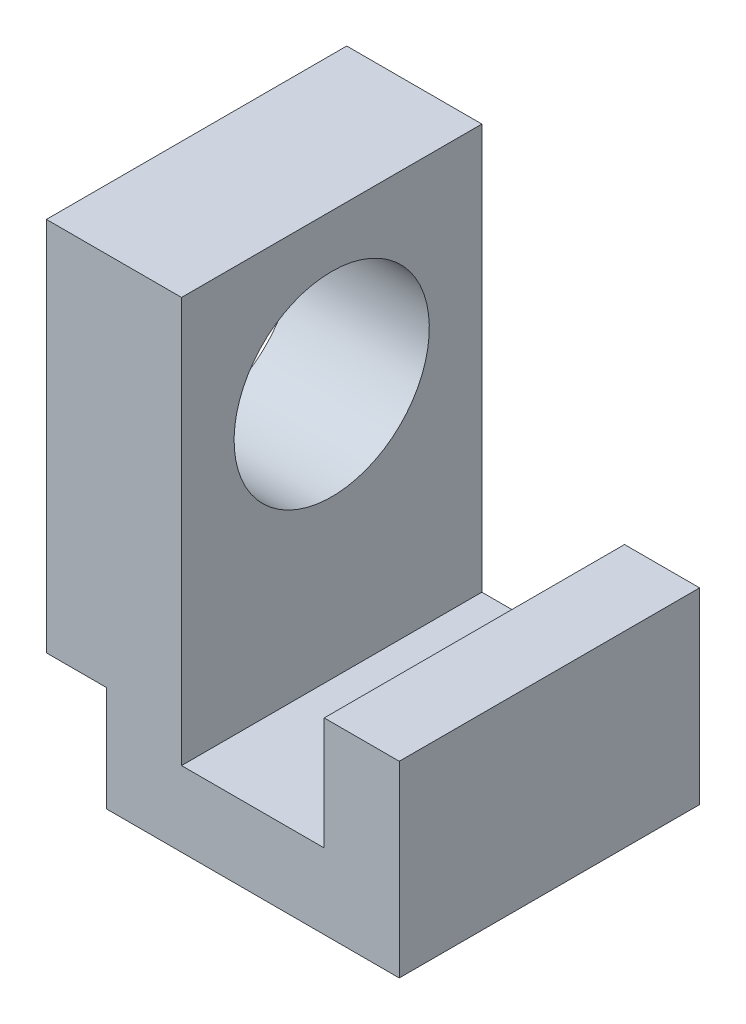
ISO-10303-21;
HEADER;
FILE_DESCRIPTION(('STEP AP214'),'2;1');
FILE_NAME('part.step','',(''),(''),'','','');
FILE_SCHEMA(('AUTOMOTIVE_DESIGN { 1 0 10303 214 1 1 1 1 }'));
ENDSEC;
DATA;
#1=APPLICATION_CONTEXT('core data for automotive mechanical design processes');
#2=APPLICATION_PROTOCOL_DEFINITION('international standard','automotive_design',2000,#1);
#3=PRODUCT_CONTEXT('',#1,'mechanical');
#4=PRODUCT('Part','Part','',(#3));
#5=PRODUCT_RELATED_PRODUCT_CATEGORY('part','',(#4));
#6=PRODUCT_DEFINITION_FORMATION('','',#4);
#7=PRODUCT_DEFINITION_CONTEXT('part definition',#1,'design');
#8=PRODUCT_DEFINITION('design','',#6,#7);
#9=PRODUCT_DEFINITION_SHAPE('','',#8);
#10=(LENGTH_UNIT() NAMED_UNIT(*) SI_UNIT(.MILLI.,.METRE.));
#11=(NAMED_UNIT(*) PLANE_ANGLE_UNIT() SI_UNIT($,.RADIAN.));
#12=(NAMED_UNIT(*) SI_UNIT($,.STERADIAN.) SOLID_ANGLE_UNIT());
#13=UNCERTAINTY_MEASURE_WITH_UNIT(LENGTH_MEASURE(1.E-05),#10,'distance_accuracy_value','');
#14=(GEOMETRIC_REPRESENTATION_CONTEXT(3) GLOBAL_UNCERTAINTY_ASSIGNED_CONTEXT((#13)) GLOBAL_UNIT_ASSIGNED_CONTEXT((#10,
#11,#12)) REPRESENTATION_CONTEXT('',''));
#15=CARTESIAN_POINT('',(0.,0.,0.));
#16=DIRECTION('',(0.,0.,1.));
#17=DIRECTION('',(1.,0.,0.));
#18=AXIS2_PLACEMENT_3D('',#15,#16,#17);
#19=CARTESIAN_POINT('',(39.,0.,20.));
#20=DIRECTION('',(0.,1.,0.));
#21=DIRECTION('',(-1.,0.,0.));
#22=AXIS2_PLACEMENT_3D('',#19,#20,#21);
#23=PLANE('',#22);
#24=DIRECTION('',(1.,0.,0.));
#25=VECTOR('',#24,1.);
#26=CARTESIAN_POINT('',(39.,0.,-20.));
#27=LINE('',#26,#25);
#28=CARTESIAN_POINT('',(0.,0.,-20.));
#29=VERTEX_POINT('',#28);
#30=CARTESIAN_POINT('',(39.,0.,-20.));
#31=VERTEX_POINT('',#30);
#32=EDGE_CURVE('E153',#29,#31,#27,.T.);
#33=ORIENTED_EDGE('',*,*,#32,.T.);
#34=DIRECTION('',(0.,0.,-1.));
#35=VECTOR('',#34,1.);
#36=CARTESIAN_POINT('',(39.,0.,20.));
#37=LINE('',#36,#35);
#38=CARTESIAN_POINT('',(39.,0.,20.));
#39=VERTEX_POINT('',#38);
#40=EDGE_CURVE('E11',#39,#31,#37,.T.);
#41=ORIENTED_EDGE('',*,*,#40,.F.);
#42=DIRECTION('',(1.,0.,0.));
#43=VECTOR('',#42,1.);
#44=CARTESIAN_POINT('',(39.,0.,20.));
#45=LINE('',#44,#43);
#46=CARTESIAN_POINT('',(0.,0.,20.));
#47=VERTEX_POINT('',#46);
#48=EDGE_CURVE('E181',#47,#39,#45,.T.);
#49=ORIENTED_EDGE('',*,*,#48,.F.);
#50=DIRECTION('',(0.,0.,-1.));
#51=VECTOR('',#50,1.);
#52=CARTESIAN_POINT('',(0.,0.,20.));
#53=LINE('',#52,#51);
#54=EDGE_CURVE('E149',#47,#29,#53,.T.);
#55=ORIENTED_EDGE('',*,*,#54,.T.);
#56=EDGE_LOOP('',(#33,#41,#49,#55));
#57=FACE_BOUND('',#56,.T.);
#58=ADVANCED_FACE('F39',(#57),#23,.F.);
#59=CARTESIAN_POINT('',(39.,25.,20.));
#60=DIRECTION('',(-1.,0.,0.));
#61=DIRECTION('',(0.,0.,1.));
#62=AXIS2_PLACEMENT_3D('',#59,#60,#61);
#63=PLANE('',#62);
#64=DIRECTION('',(0.,1.,0.));
#65=VECTOR('',#64,1.);
#66=CARTESIAN_POINT('',(39.,25.,-20.));
#67=LINE('',#66,#65);
#68=CARTESIAN_POINT('',(39.,25.,-20.));
#69=VERTEX_POINT('',#68);
#70=EDGE_CURVE('E157',#31,#69,#67,.T.);
#71=ORIENTED_EDGE('',*,*,#70,.T.);
#72=DIRECTION('',(0.,0.,-1.));
#73=VECTOR('',#72,1.);
#74=CARTESIAN_POINT('',(39.,25.,20.));
#75=LINE('',#74,#73);
#76=CARTESIAN_POINT('',(39.,25.,20.));
#77=VERTEX_POINT('',#76);
#78=EDGE_CURVE('E49',#77,#69,#75,.T.);
#79=ORIENTED_EDGE('',*,*,#78,.F.);
#80=DIRECTION('',(0.,1.,0.));
#81=VECTOR('',#80,1.);
#82=CARTESIAN_POINT('',(39.,25.,20.));
#83=LINE('',#82,#81);
#84=EDGE_CURVE('E106',#39,#77,#83,.T.);
#85=ORIENTED_EDGE('',*,*,#84,.F.);
#86=ORIENTED_EDGE('',*,*,#40,.T.);
#87=EDGE_LOOP('',(#71,#79,#85,#86));
#88=FACE_BOUND('',#87,.T.);
#89=ADVANCED_FACE('F263',(#88),#63,.F.);
#90=CARTESIAN_POINT('',(29.,25.,20.));
#91=DIRECTION('',(0.,-1.,0.));
#92=DIRECTION('',(0.,0.,-1.));
#93=AXIS2_PLACEMENT_3D('',#90,#91,#92);
#94=PLANE('',#93);
#95=DIRECTION('',(-1.,0.,0.));
#96=VECTOR('',#95,1.);
#97=CARTESIAN_POINT('',(29.,25.,-20.));
#98=LINE('',#97,#96);
#99=CARTESIAN_POINT('',(29.,25.,-20.));
#100=VERTEX_POINT('',#99);
#101=EDGE_CURVE('E160',#69,#100,#98,.T.);
#102=ORIENTED_EDGE('',*,*,#101,.T.);
#103=DIRECTION('',(0.,0.,-1.));
#104=VECTOR('',#103,1.);
#105=CARTESIAN_POINT('',(29.,25.,20.));
#106=LINE('',#105,#104);
#107=CARTESIAN_POINT('',(29.,25.,20.));
#108=VERTEX_POINT('',#107);
#109=EDGE_CURVE('E200',#108,#100,#106,.T.);
#110=ORIENTED_EDGE('',*,*,#109,.F.);
#111=DIRECTION('',(-1.,0.,0.));
#112=VECTOR('',#111,1.);
#113=CARTESIAN_POINT('',(29.,25.,20.));
#114=LINE('',#113,#112);
#115=EDGE_CURVE('E211',#77,#108,#114,.T.);
#116=ORIENTED_EDGE('',*,*,#115,.F.);
#117=ORIENTED_EDGE('',*,*,#78,.T.);
#118=EDGE_LOOP('',(#102,#110,#116,#117));
#119=FACE_BOUND('',#118,.T.);
#120=ADVANCED_FACE('F209',(#119),#94,.F.);
#121=CARTESIAN_POINT('',(29.,10.,20.));
#122=DIRECTION('',(1.,0.,0.));
#123=DIRECTION('',(0.,0.,-1.));
#124=AXIS2_PLACEMENT_3D('',#121,#122,#123);
#125=PLANE('',#124);
#126=DIRECTION('',(0.,-1.,0.));
#127=VECTOR('',#126,1.);
#128=CARTESIAN_POINT('',(29.,10.,-20.));
#129=LINE('',#128,#127);
#130=CARTESIAN_POINT('',(29.,10.,-20.));
#131=VERTEX_POINT('',#130);
#132=EDGE_CURVE('E163',#100,#131,#129,.T.);
#133=ORIENTED_EDGE('',*,*,#132,.T.);
#134=DIRECTION('',(0.,0.,-1.));
#135=VECTOR('',#134,1.);
#136=CARTESIAN_POINT('',(29.,10.,20.));
#137=LINE('',#136,#135);
#138=CARTESIAN_POINT('',(29.,10.,20.));
#139=VERTEX_POINT('',#138);
#140=EDGE_CURVE('E196',#139,#131,#137,.T.);
#141=ORIENTED_EDGE('',*,*,#140,.F.);
#142=DIRECTION('',(0.,-1.,0.));
#143=VECTOR('',#142,1.);
#144=CARTESIAN_POINT('',(29.,10.,20.));
#145=LINE('',#144,#143);
#146=EDGE_CURVE('E230',#108,#139,#145,.T.);
#147=ORIENTED_EDGE('',*,*,#146,.F.);
#148=ORIENTED_EDGE('',*,*,#109,.T.);
#149=EDGE_LOOP('',(#133,#141,#147,#148));
#150=FACE_BOUND('',#149,.T.);
#151=ADVANCED_FACE('F220',(#150),#125,.F.);
#152=CARTESIAN_POINT('',(10.,9.99999999999999,20.));
#153=DIRECTION('',(0.,-1.,0.));
#154=DIRECTION('',(1.,0.,0.));
#155=AXIS2_PLACEMENT_3D('',#152,#153,#154);
#156=PLANE('',#155);
#157=DIRECTION('',(-1.,0.,0.));
#158=VECTOR('',#157,1.);
#159=CARTESIAN_POINT('',(10.,9.99999999999999,-20.));
#160=LINE('',#159,#158);
#161=CARTESIAN_POINT('',(10.,9.99999999999999,-20.));
#162=VERTEX_POINT('',#161);
#163=EDGE_CURVE('E166',#131,#162,#160,.T.);
#164=ORIENTED_EDGE('',*,*,#163,.T.);
#165=DIRECTION('',(0.,0.,-1.));
#166=VECTOR('',#165,1.);
#167=CARTESIAN_POINT('',(10.,9.99999999999999,20.));
#168=LINE('',#167,#166);
#169=CARTESIAN_POINT('',(10.,9.99999999999999,20.));
#170=VERTEX_POINT('',#169);
#171=EDGE_CURVE('E192',#170,#162,#168,.T.);
#172=ORIENTED_EDGE('',*,*,#171,.F.);
#173=DIRECTION('',(-1.,0.,0.));
#174=VECTOR('',#173,1.);
#175=CARTESIAN_POINT('',(10.,9.99999999999999,20.));
#176=LINE('',#175,#174);
#177=EDGE_CURVE('E226',#139,#170,#176,.T.);
#178=ORIENTED_EDGE('',*,*,#177,.F.);
#179=ORIENTED_EDGE('',*,*,#140,.T.);
#180=EDGE_LOOP('',(#164,#172,#178,#179));
#181=FACE_BOUND('',#180,.T.);
#182=ADVANCED_FACE('F224',(#181),#156,.F.);
#183=CARTESIAN_POINT('',(10.,64.,20.));
#184=DIRECTION('',(-1.,0.,0.));
#185=DIRECTION('',(0.,-1.,0.));
#186=AXIS2_PLACEMENT_3D('',#183,#184,#185);
#187=PLANE('',#186);
#188=CARTESIAN_POINT('',(10.,44.,0.));
#189=DIRECTION('',(1.,0.,0.));
#190=DIRECTION('',(0.,1.,0.));
#191=AXIS2_PLACEMENT_3D('',#188,#189,#190);
#192=CIRCLE('',#191,13.);
#193=CARTESIAN_POINT('',(10.,57.,0.));
#194=VERTEX_POINT('',#193);
#195=EDGE_CURVE('E244',#194,#194,#192,.T.);
#196=ORIENTED_EDGE('',*,*,#195,.F.);
#197=EDGE_LOOP('',(#196));
#198=FACE_BOUND('',#197,.T.);
#199=DIRECTION('',(0.,1.,0.));
#200=VECTOR('',#199,1.);
#201=CARTESIAN_POINT('',(10.,64.,-20.));
#202=LINE('',#201,#200);
#203=CARTESIAN_POINT('',(10.,64.,-20.));
#204=VERTEX_POINT('',#203);
#205=EDGE_CURVE('E169',#162,#204,#202,.T.);
#206=ORIENTED_EDGE('',*,*,#205,.T.);
#207=DIRECTION('',(0.,0.,-1.));
#208=VECTOR('',#207,1.);
#209=CARTESIAN_POINT('',(10.,64.,20.));
#210=LINE('',#209,#208);
#211=CARTESIAN_POINT('',(10.,64.,20.));
#212=VERTEX_POINT('',#211);
#213=EDGE_CURVE('E188',#212,#204,#210,.T.);
#214=ORIENTED_EDGE('',*,*,#213,.F.);
#215=DIRECTION('',(0.,1.,0.));
#216=VECTOR('',#215,1.);
#217=CARTESIAN_POINT('',(10.,64.,20.));
#218=LINE('',#217,#216);
#219=EDGE_CURVE('E229',#170,#212,#218,.T.);
#220=ORIENTED_EDGE('',*,*,#219,.F.);
#221=ORIENTED_EDGE('',*,*,#171,.T.);
#222=EDGE_LOOP('',(#206,#214,#220,#221));
#223=FACE_BOUND('',#222,.T.);
#224=ADVANCED_FACE('F275',(#198,#223),#187,.F.);
#225=CARTESIAN_POINT('',(-8.,64.,20.));
#226=DIRECTION('',(0.,-1.,0.));
#227=DIRECTION('',(0.,0.,-1.));
#228=AXIS2_PLACEMENT_3D('',#225,#226,#227);
#229=PLANE('',#228);
#230=DIRECTION('',(-1.,0.,0.));
#231=VECTOR('',#230,1.);
#232=CARTESIAN_POINT('',(-8.,64.,-20.));
#233=LINE('',#232,#231);
#234=CARTESIAN_POINT('',(-8.,64.,-20.));
#235=VERTEX_POINT('',#234);
#236=EDGE_CURVE('E172',#204,#235,#233,.T.);
#237=ORIENTED_EDGE('',*,*,#236,.T.);
#238=DIRECTION('',(0.,0.,-1.));
#239=VECTOR('',#238,1.);
#240=CARTESIAN_POINT('',(-8.,64.,20.));
#241=LINE('',#240,#239);
#242=CARTESIAN_POINT('',(-8.,64.,20.));
#243=VERTEX_POINT('',#242);
#244=EDGE_CURVE('E142',#243,#235,#241,.T.);
#245=ORIENTED_EDGE('',*,*,#244,.F.);
#246=DIRECTION('',(-1.,0.,0.));
#247=VECTOR('',#246,1.);
#248=CARTESIAN_POINT('',(-8.,64.,20.));
#249=LINE('',#248,#247);
#250=EDGE_CURVE('E131',#212,#243,#249,.T.);
#251=ORIENTED_EDGE('',*,*,#250,.F.);
#252=ORIENTED_EDGE('',*,*,#213,.T.);
#253=EDGE_LOOP('',(#237,#245,#251,#252));
#254=FACE_BOUND('',#253,.T.);
#255=ADVANCED_FACE('F272',(#254),#229,.F.);
#256=CARTESIAN_POINT('',(-8.,14.,20.));
#257=DIRECTION('',(1.,0.,0.));
#258=DIRECTION('',(0.,0.,-1.));
#259=AXIS2_PLACEMENT_3D('',#256,#257,#258);
#260=PLANE('',#259);
#261=CARTESIAN_POINT('',(-8.,44.,0.));
#262=DIRECTION('',(1.,0.,0.));
#263=DIRECTION('',(0.,0.,-1.));
#264=AXIS2_PLACEMENT_3D('',#261,#262,#263);
#265=CIRCLE('',#264,13.);
#266=CARTESIAN_POINT('',(-8.,44.,-13.));
#267=VERTEX_POINT('',#266);
#268=EDGE_CURVE('E42',#267,#267,#265,.T.);
#269=ORIENTED_EDGE('',*,*,#268,.T.);
#270=EDGE_LOOP('',(#269));
#271=FACE_BOUND('',#270,.T.);
#272=DIRECTION('',(0.,-1.,0.));
#273=VECTOR('',#272,1.);
#274=CARTESIAN_POINT('',(-8.,14.,-20.));
#275=LINE('',#274,#273);
#276=CARTESIAN_POINT('',(-8.,14.,-20.));
#277=VERTEX_POINT('',#276);
#278=EDGE_CURVE('E140',#235,#277,#275,.T.);
#279=ORIENTED_EDGE('',*,*,#278,.T.);
#280=DIRECTION('',(0.,0.,-1.));
#281=VECTOR('',#280,1.);
#282=CARTESIAN_POINT('',(-8.,14.,20.));
#283=LINE('',#282,#281);
#284=CARTESIAN_POINT('',(-8.,14.,20.));
#285=VERTEX_POINT('',#284);
#286=EDGE_CURVE('E137',#285,#277,#283,.T.);
#287=ORIENTED_EDGE('',*,*,#286,.F.);
#288=DIRECTION('',(0.,-1.,0.));
#289=VECTOR('',#288,1.);
#290=CARTESIAN_POINT('',(-8.,14.,20.));
#291=LINE('',#290,#289);
#292=EDGE_CURVE('E125',#243,#285,#291,.T.);
#293=ORIENTED_EDGE('',*,*,#292,.F.);
#294=ORIENTED_EDGE('',*,*,#244,.T.);
#295=EDGE_LOOP('',(#279,#287,#293,#294));
#296=FACE_BOUND('',#295,.T.);
#297=ADVANCED_FACE('F138',(#271,#296),#260,.F.);
#298=CARTESIAN_POINT('',(0.,14.,20.));
#299=DIRECTION('',(0.,1.,0.));
#300=DIRECTION('',(-1.,0.,0.));
#301=AXIS2_PLACEMENT_3D('',#298,#299,#300);
#302=PLANE('',#301);
#303=DIRECTION('',(1.,0.,0.));
#304=VECTOR('',#303,1.);
#305=CARTESIAN_POINT('',(0.,14.,-20.));
#306=LINE('',#305,#304);
#307=CARTESIAN_POINT('',(0.,14.,-20.));
#308=VERTEX_POINT('',#307);
#309=EDGE_CURVE('E92',#277,#308,#306,.T.);
#310=ORIENTED_EDGE('',*,*,#309,.T.);
#311=DIRECTION('',(0.,0.,-1.));
#312=VECTOR('',#311,1.);
#313=CARTESIAN_POINT('',(0.,14.,20.));
#314=LINE('',#313,#312);
#315=CARTESIAN_POINT('',(0.,14.,20.));
#316=VERTEX_POINT('',#315);
#317=EDGE_CURVE('E143',#316,#308,#314,.T.);
#318=ORIENTED_EDGE('',*,*,#317,.F.);
#319=DIRECTION('',(1.,0.,0.));
#320=VECTOR('',#319,1.);
#321=CARTESIAN_POINT('',(0.,14.,20.));
#322=LINE('',#321,#320);
#323=EDGE_CURVE('E129',#285,#316,#322,.T.);
#324=ORIENTED_EDGE('',*,*,#323,.F.);
#325=ORIENTED_EDGE('',*,*,#286,.T.);
#326=EDGE_LOOP('',(#310,#318,#324,#325));
#327=FACE_BOUND('',#326,.T.);
#328=ADVANCED_FACE('F145',(#327),#302,.F.);
#329=CARTESIAN_POINT('',(0.,0.,20.));
#330=DIRECTION('',(1.,0.,0.));
#331=DIRECTION('',(0.,0.,-1.));
#332=AXIS2_PLACEMENT_3D('',#329,#330,#331);
#333=PLANE('',#332);
#334=DIRECTION('',(0.,-1.,0.));
#335=VECTOR('',#334,1.);
#336=CARTESIAN_POINT('',(0.,0.,-20.));
#337=LINE('',#336,#335);
#338=EDGE_CURVE('E98',#308,#29,#337,.T.);
#339=ORIENTED_EDGE('',*,*,#338,.T.);
#340=ORIENTED_EDGE('',*,*,#54,.F.);
#341=DIRECTION('',(0.,-1.,0.));
#342=VECTOR('',#341,1.);
#343=CARTESIAN_POINT('',(0.,0.,20.));
#344=LINE('',#343,#342);
#345=EDGE_CURVE('E57',#316,#47,#344,.T.);
#346=ORIENTED_EDGE('',*,*,#345,.F.);
#347=ORIENTED_EDGE('',*,*,#317,.T.);
#348=EDGE_LOOP('',(#339,#340,#346,#347));
#349=FACE_BOUND('',#348,.T.);
#350=ADVANCED_FACE('F320',(#349),#333,.F.);
#351=CARTESIAN_POINT('',(0.,0.,20.));
#352=DIRECTION('',(0.,0.,-1.));
#353=DIRECTION('',(-1.,0.,0.));
#354=AXIS2_PLACEMENT_3D('',#351,#352,#353);
#355=PLANE('',#354);
#356=ORIENTED_EDGE('',*,*,#48,.T.);
#357=ORIENTED_EDGE('',*,*,#84,.T.);
#358=ORIENTED_EDGE('',*,*,#115,.T.);
#359=ORIENTED_EDGE('',*,*,#146,.T.);
#360=ORIENTED_EDGE('',*,*,#177,.T.);
#361=ORIENTED_EDGE('',*,*,#219,.T.);
#362=ORIENTED_EDGE('',*,*,#250,.T.);
#363=ORIENTED_EDGE('',*,*,#292,.T.);
#364=ORIENTED_EDGE('',*,*,#323,.T.);
#365=ORIENTED_EDGE('',*,*,#345,.T.);
#366=EDGE_LOOP('',(#356,#357,#358,#359,#360,#361,#362,#363,#364,#365));
#367=FACE_BOUND('',#366,.T.);
#368=ADVANCED_FACE('F127',(#367),#355,.F.);
#369=CARTESIAN_POINT('',(0.,0.,-20.));
#370=DIRECTION('',(0.,0.,-1.));
#371=DIRECTION('',(-1.,0.,0.));
#372=AXIS2_PLACEMENT_3D('',#369,#370,#371);
#373=PLANE('',#372);
#374=ORIENTED_EDGE('',*,*,#32,.F.);
#375=ORIENTED_EDGE('',*,*,#338,.F.);
#376=ORIENTED_EDGE('',*,*,#309,.F.);
#377=ORIENTED_EDGE('',*,*,#278,.F.);
#378=ORIENTED_EDGE('',*,*,#236,.F.);
#379=ORIENTED_EDGE('',*,*,#205,.F.);
#380=ORIENTED_EDGE('',*,*,#163,.F.);
#381=ORIENTED_EDGE('',*,*,#132,.F.);
#382=ORIENTED_EDGE('',*,*,#101,.F.);
#383=ORIENTED_EDGE('',*,*,#70,.F.);
#384=EDGE_LOOP('',(#374,#375,#376,#377,#378,#379,#380,#381,#382,#383));
#385=FACE_BOUND('',#384,.T.);
#386=ADVANCED_FACE('F215',(#385),#373,.T.);
#387=CARTESIAN_POINT('',(-30.,44.,0.));
#388=DIRECTION('',(1.,0.,0.));
#389=DIRECTION('',(0.,1.,0.));
#390=AXIS2_PLACEMENT_3D('',#387,#388,#389);
#391=CYLINDRICAL_SURFACE('',#390,13.);
#392=ORIENTED_EDGE('',*,*,#195,.T.);
#393=EDGE_LOOP('',(#392));
#394=FACE_BOUND('',#393,.T.);
#395=ORIENTED_EDGE('',*,*,#268,.F.);
#396=EDGE_LOOP('',(#395));
#397=FACE_BOUND('',#396,.T.);
#398=ADVANCED_FACE('F254',(#394,#397),#391,.F.);
#399=CLOSED_SHELL('',(#58,#89,#120,#151,#182,#224,#255,#297,#328,#350,#368,#386,#398));
#400=MANIFOLD_SOLID_BREP('B2',#399);
#401=ADVANCED_BREP_SHAPE_REPRESENTATION('',(#18,#400),#14);
#402=SHAPE_DEFINITION_REPRESENTATION(#9,#401);
ENDSEC;
END-ISO-10303-21;
